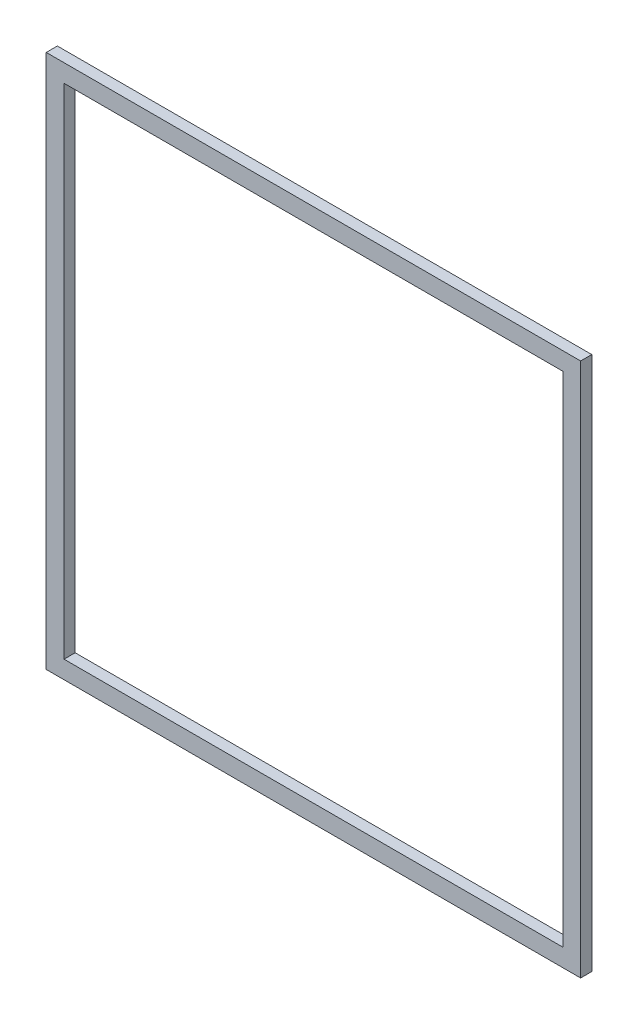
ISO-10303-21;
HEADER;
FILE_DESCRIPTION(('STEP AP214'),'2;1');
FILE_NAME('part.step','',(''),(''),'','','');
FILE_SCHEMA(('AUTOMOTIVE_DESIGN { 1 0 10303 214 1 1 1 1 }'));
ENDSEC;
DATA;
#1=APPLICATION_CONTEXT('core data for automotive mechanical design processes');
#2=APPLICATION_PROTOCOL_DEFINITION('international standard','automotive_design',2000,#1);
#3=PRODUCT_CONTEXT('',#1,'mechanical');
#4=PRODUCT('Part','Part','',(#3));
#5=PRODUCT_RELATED_PRODUCT_CATEGORY('part','',(#4));
#6=PRODUCT_DEFINITION_FORMATION('','',#4);
#7=PRODUCT_DEFINITION_CONTEXT('part definition',#1,'design');
#8=PRODUCT_DEFINITION('design','',#6,#7);
#9=PRODUCT_DEFINITION_SHAPE('','',#8);
#10=(LENGTH_UNIT() NAMED_UNIT(*) SI_UNIT(.MILLI.,.METRE.));
#11=(NAMED_UNIT(*) PLANE_ANGLE_UNIT() SI_UNIT($,.RADIAN.));
#12=(NAMED_UNIT(*) SI_UNIT($,.STERADIAN.) SOLID_ANGLE_UNIT());
#13=UNCERTAINTY_MEASURE_WITH_UNIT(LENGTH_MEASURE(1.E-05),#10,'distance_accuracy_value','');
#14=(GEOMETRIC_REPRESENTATION_CONTEXT(3) GLOBAL_UNCERTAINTY_ASSIGNED_CONTEXT((#13)) GLOBAL_UNIT_ASSIGNED_CONTEXT((#10,
#11,#12)) REPRESENTATION_CONTEXT('',''));
#15=CARTESIAN_POINT('',(0.,0.,0.));
#16=DIRECTION('',(0.,0.,1.));
#17=DIRECTION('',(1.,0.,0.));
#18=AXIS2_PLACEMENT_3D('',#15,#16,#17);
#19=CARTESIAN_POINT('',(-24.,-24.,1.));
#20=DIRECTION('',(0.,0.,1.));
#21=DIRECTION('',(1.,0.,0.));
#22=AXIS2_PLACEMENT_3D('',#19,#20,#21);
#23=PLANE('',#22);
#24=DIRECTION('',(0.,-1.,0.));
#25=VECTOR('',#24,1.);
#26=CARTESIAN_POINT('',(-24.,24.,1.));
#27=LINE('',#26,#25);
#28=CARTESIAN_POINT('',(-24.,24.,1.));
#29=VERTEX_POINT('',#28);
#30=CARTESIAN_POINT('',(-24.,-24.,1.));
#31=VERTEX_POINT('',#30);
#32=EDGE_CURVE('E126',#29,#31,#27,.T.);
#33=ORIENTED_EDGE('',*,*,#32,.T.);
#34=DIRECTION('',(1.,0.,0.));
#35=VECTOR('',#34,1.);
#36=CARTESIAN_POINT('',(-24.,-24.,1.));
#37=LINE('',#36,#35);
#38=CARTESIAN_POINT('',(24.,-24.,1.));
#39=VERTEX_POINT('',#38);
#40=EDGE_CURVE('E129',#31,#39,#37,.T.);
#41=ORIENTED_EDGE('',*,*,#40,.T.);
#42=DIRECTION('',(0.,1.,0.));
#43=VECTOR('',#42,1.);
#44=CARTESIAN_POINT('',(24.,24.,1.));
#45=LINE('',#44,#43);
#46=CARTESIAN_POINT('',(24.,24.,1.));
#47=VERTEX_POINT('',#46);
#48=EDGE_CURVE('E131',#39,#47,#45,.T.);
#49=ORIENTED_EDGE('',*,*,#48,.T.);
#50=DIRECTION('',(-1.,0.,0.));
#51=VECTOR('',#50,1.);
#52=CARTESIAN_POINT('',(-24.,24.,1.));
#53=LINE('',#52,#51);
#54=EDGE_CURVE('E133',#47,#29,#53,.T.);
#55=ORIENTED_EDGE('',*,*,#54,.T.);
#56=EDGE_LOOP('',(#33,#41,#49,#55));
#57=FACE_BOUND('',#56,.T.);
#58=DIRECTION('',(0.,-1.,0.));
#59=VECTOR('',#58,1.);
#60=CARTESIAN_POINT('',(-22.4,22.4,1.));
#61=LINE('',#60,#59);
#62=CARTESIAN_POINT('',(-22.4,22.4,1.));
#63=VERTEX_POINT('',#62);
#64=CARTESIAN_POINT('',(-22.4,-22.4,1.));
#65=VERTEX_POINT('',#64);
#66=EDGE_CURVE('E108',#63,#65,#61,.T.);
#67=ORIENTED_EDGE('',*,*,#66,.F.);
#68=DIRECTION('',(-1.,0.,0.));
#69=VECTOR('',#68,1.);
#70=CARTESIAN_POINT('',(-22.4,22.4,1.));
#71=LINE('',#70,#69);
#72=CARTESIAN_POINT('',(22.4,22.4,1.));
#73=VERTEX_POINT('',#72);
#74=EDGE_CURVE('E97',#73,#63,#71,.T.);
#75=ORIENTED_EDGE('',*,*,#74,.F.);
#76=DIRECTION('',(0.,1.,0.));
#77=VECTOR('',#76,1.);
#78=CARTESIAN_POINT('',(22.4,22.4,1.));
#79=LINE('',#78,#77);
#80=CARTESIAN_POINT('',(22.4,-22.4,1.));
#81=VERTEX_POINT('',#80);
#82=EDGE_CURVE('E112',#81,#73,#79,.T.);
#83=ORIENTED_EDGE('',*,*,#82,.F.);
#84=DIRECTION('',(1.,0.,0.));
#85=VECTOR('',#84,1.);
#86=CARTESIAN_POINT('',(-22.4,-22.4,1.));
#87=LINE('',#86,#85);
#88=EDGE_CURVE('E110',#65,#81,#87,.T.);
#89=ORIENTED_EDGE('',*,*,#88,.F.);
#90=EDGE_LOOP('',(#67,#75,#83,#89));
#91=FACE_BOUND('',#90,.T.);
#92=ADVANCED_FACE('F17',(#57,#91),#23,.T.);
#93=CARTESIAN_POINT('',(-24.,-24.,0.));
#94=DIRECTION('',(0.,0.,1.));
#95=DIRECTION('',(1.,0.,0.));
#96=AXIS2_PLACEMENT_3D('',#93,#94,#95);
#97=PLANE('',#96);
#98=DIRECTION('',(0.,-1.,0.));
#99=VECTOR('',#98,1.);
#100=CARTESIAN_POINT('',(-24.,24.,0.));
#101=LINE('',#100,#99);
#102=CARTESIAN_POINT('',(-24.,24.,0.));
#103=VERTEX_POINT('',#102);
#104=CARTESIAN_POINT('',(-24.,-24.,0.));
#105=VERTEX_POINT('',#104);
#106=EDGE_CURVE('E98',#103,#105,#101,.T.);
#107=ORIENTED_EDGE('',*,*,#106,.F.);
#108=DIRECTION('',(-1.,0.,0.));
#109=VECTOR('',#108,1.);
#110=CARTESIAN_POINT('',(-24.,24.,0.));
#111=LINE('',#110,#109);
#112=CARTESIAN_POINT('',(24.,24.,0.));
#113=VERTEX_POINT('',#112);
#114=EDGE_CURVE('E124',#113,#103,#111,.T.);
#115=ORIENTED_EDGE('',*,*,#114,.F.);
#116=DIRECTION('',(0.,1.,0.));
#117=VECTOR('',#116,1.);
#118=CARTESIAN_POINT('',(24.,24.,0.));
#119=LINE('',#118,#117);
#120=CARTESIAN_POINT('',(24.,-24.,0.));
#121=VERTEX_POINT('',#120);
#122=EDGE_CURVE('E122',#121,#113,#119,.T.);
#123=ORIENTED_EDGE('',*,*,#122,.F.);
#124=DIRECTION('',(1.,0.,0.));
#125=VECTOR('',#124,1.);
#126=CARTESIAN_POINT('',(-24.,-24.,0.));
#127=LINE('',#126,#125);
#128=EDGE_CURVE('E120',#105,#121,#127,.T.);
#129=ORIENTED_EDGE('',*,*,#128,.F.);
#130=EDGE_LOOP('',(#107,#115,#123,#129));
#131=FACE_BOUND('',#130,.T.);
#132=DIRECTION('',(-1.,0.,0.));
#133=VECTOR('',#132,1.);
#134=CARTESIAN_POINT('',(-22.4,22.4,0.));
#135=LINE('',#134,#133);
#136=CARTESIAN_POINT('',(22.4,22.4,0.));
#137=VERTEX_POINT('',#136);
#138=CARTESIAN_POINT('',(-22.4,22.4,0.));
#139=VERTEX_POINT('',#138);
#140=EDGE_CURVE('E40',#137,#139,#135,.T.);
#141=ORIENTED_EDGE('',*,*,#140,.T.);
#142=DIRECTION('',(0.,-1.,0.));
#143=VECTOR('',#142,1.);
#144=CARTESIAN_POINT('',(-22.4,22.4,0.));
#145=LINE('',#144,#143);
#146=CARTESIAN_POINT('',(-22.4,-22.4,0.));
#147=VERTEX_POINT('',#146);
#148=EDGE_CURVE('E84',#139,#147,#145,.T.);
#149=ORIENTED_EDGE('',*,*,#148,.T.);
#150=DIRECTION('',(1.,0.,0.));
#151=VECTOR('',#150,1.);
#152=CARTESIAN_POINT('',(-22.4,-22.4,0.));
#153=LINE('',#152,#151);
#154=CARTESIAN_POINT('',(22.4,-22.4,0.));
#155=VERTEX_POINT('',#154);
#156=EDGE_CURVE('E93',#147,#155,#153,.T.);
#157=ORIENTED_EDGE('',*,*,#156,.T.);
#158=DIRECTION('',(0.,1.,0.));
#159=VECTOR('',#158,1.);
#160=CARTESIAN_POINT('',(22.4,22.4,0.));
#161=LINE('',#160,#159);
#162=EDGE_CURVE('E102',#155,#137,#161,.T.);
#163=ORIENTED_EDGE('',*,*,#162,.T.);
#164=EDGE_LOOP('',(#141,#149,#157,#163));
#165=FACE_BOUND('',#164,.T.);
#166=ADVANCED_FACE('F101',(#131,#165),#97,.F.);
#167=CARTESIAN_POINT('',(-24.,24.,1.));
#168=DIRECTION('',(1.,0.,0.));
#169=DIRECTION('',(0.,0.,-1.));
#170=AXIS2_PLACEMENT_3D('',#167,#168,#169);
#171=PLANE('',#170);
#172=ORIENTED_EDGE('',*,*,#106,.T.);
#173=DIRECTION('',(0.,0.,-1.));
#174=VECTOR('',#173,1.);
#175=CARTESIAN_POINT('',(-24.,-24.,1.));
#176=LINE('',#175,#174);
#177=EDGE_CURVE('E11',#31,#105,#176,.T.);
#178=ORIENTED_EDGE('',*,*,#177,.F.);
#179=ORIENTED_EDGE('',*,*,#32,.F.);
#180=DIRECTION('',(0.,0.,-1.));
#181=VECTOR('',#180,1.);
#182=CARTESIAN_POINT('',(-24.,24.,1.));
#183=LINE('',#182,#181);
#184=EDGE_CURVE('E135',#29,#103,#183,.T.);
#185=ORIENTED_EDGE('',*,*,#184,.T.);
#186=EDGE_LOOP('',(#172,#178,#179,#185));
#187=FACE_BOUND('',#186,.T.);
#188=ADVANCED_FACE('F19',(#187),#171,.F.);
#189=CARTESIAN_POINT('',(-24.,-24.,1.));
#190=DIRECTION('',(0.,1.,0.));
#191=DIRECTION('',(0.,0.,1.));
#192=AXIS2_PLACEMENT_3D('',#189,#190,#191);
#193=PLANE('',#192);
#194=ORIENTED_EDGE('',*,*,#128,.T.);
#195=DIRECTION('',(0.,0.,-1.));
#196=VECTOR('',#195,1.);
#197=CARTESIAN_POINT('',(24.,-24.,1.));
#198=LINE('',#197,#196);
#199=EDGE_CURVE('E25',#39,#121,#198,.T.);
#200=ORIENTED_EDGE('',*,*,#199,.F.);
#201=ORIENTED_EDGE('',*,*,#40,.F.);
#202=ORIENTED_EDGE('',*,*,#177,.T.);
#203=EDGE_LOOP('',(#194,#200,#201,#202));
#204=FACE_BOUND('',#203,.T.);
#205=ADVANCED_FACE('F160',(#204),#193,.F.);
#206=CARTESIAN_POINT('',(24.,24.,1.));
#207=DIRECTION('',(-1.,0.,0.));
#208=DIRECTION('',(0.,0.,1.));
#209=AXIS2_PLACEMENT_3D('',#206,#207,#208);
#210=PLANE('',#209);
#211=ORIENTED_EDGE('',*,*,#122,.T.);
#212=DIRECTION('',(0.,0.,-1.));
#213=VECTOR('',#212,1.);
#214=CARTESIAN_POINT('',(24.,24.,1.));
#215=LINE('',#214,#213);
#216=EDGE_CURVE('E138',#47,#113,#215,.T.);
#217=ORIENTED_EDGE('',*,*,#216,.F.);
#218=ORIENTED_EDGE('',*,*,#48,.F.);
#219=ORIENTED_EDGE('',*,*,#199,.T.);
#220=EDGE_LOOP('',(#211,#217,#218,#219));
#221=FACE_BOUND('',#220,.T.);
#222=ADVANCED_FACE('F145',(#221),#210,.F.);
#223=CARTESIAN_POINT('',(-24.,24.,1.));
#224=DIRECTION('',(0.,-1.,0.));
#225=DIRECTION('',(0.,0.,-1.));
#226=AXIS2_PLACEMENT_3D('',#223,#224,#225);
#227=PLANE('',#226);
#228=ORIENTED_EDGE('',*,*,#114,.T.);
#229=ORIENTED_EDGE('',*,*,#184,.F.);
#230=ORIENTED_EDGE('',*,*,#54,.F.);
#231=ORIENTED_EDGE('',*,*,#216,.T.);
#232=EDGE_LOOP('',(#228,#229,#230,#231));
#233=FACE_BOUND('',#232,.T.);
#234=ADVANCED_FACE('F153',(#233),#227,.F.);
#235=CARTESIAN_POINT('',(-22.4,22.4,1.));
#236=DIRECTION('',(0.,-1.,0.));
#237=DIRECTION('',(0.,0.,-1.));
#238=AXIS2_PLACEMENT_3D('',#235,#236,#237);
#239=PLANE('',#238);
#240=ORIENTED_EDGE('',*,*,#140,.F.);
#241=DIRECTION('',(0.,0.,-1.));
#242=VECTOR('',#241,1.);
#243=CARTESIAN_POINT('',(22.4,22.4,1.));
#244=LINE('',#243,#242);
#245=EDGE_CURVE('E114',#73,#137,#244,.T.);
#246=ORIENTED_EDGE('',*,*,#245,.F.);
#247=ORIENTED_EDGE('',*,*,#74,.T.);
#248=DIRECTION('',(0.,0.,-1.));
#249=VECTOR('',#248,1.);
#250=CARTESIAN_POINT('',(-22.4,22.4,1.));
#251=LINE('',#250,#249);
#252=EDGE_CURVE('E86',#63,#139,#251,.T.);
#253=ORIENTED_EDGE('',*,*,#252,.T.);
#254=EDGE_LOOP('',(#240,#246,#247,#253));
#255=FACE_BOUND('',#254,.T.);
#256=ADVANCED_FACE('F95',(#255),#239,.T.);
#257=CARTESIAN_POINT('',(-22.4,22.4,1.));
#258=DIRECTION('',(1.,0.,0.));
#259=DIRECTION('',(0.,1.,0.));
#260=AXIS2_PLACEMENT_3D('',#257,#258,#259);
#261=PLANE('',#260);
#262=ORIENTED_EDGE('',*,*,#148,.F.);
#263=ORIENTED_EDGE('',*,*,#252,.F.);
#264=ORIENTED_EDGE('',*,*,#66,.T.);
#265=DIRECTION('',(0.,0.,-1.));
#266=VECTOR('',#265,1.);
#267=CARTESIAN_POINT('',(-22.4,-22.4,1.));
#268=LINE('',#267,#266);
#269=EDGE_CURVE('E89',#65,#147,#268,.T.);
#270=ORIENTED_EDGE('',*,*,#269,.T.);
#271=EDGE_LOOP('',(#262,#263,#264,#270));
#272=FACE_BOUND('',#271,.T.);
#273=ADVANCED_FACE('F85',(#272),#261,.T.);
#274=CARTESIAN_POINT('',(-22.4,-22.4,1.));
#275=DIRECTION('',(0.,1.,0.));
#276=DIRECTION('',(-1.,0.,0.));
#277=AXIS2_PLACEMENT_3D('',#274,#275,#276);
#278=PLANE('',#277);
#279=ORIENTED_EDGE('',*,*,#156,.F.);
#280=ORIENTED_EDGE('',*,*,#269,.F.);
#281=ORIENTED_EDGE('',*,*,#88,.T.);
#282=DIRECTION('',(0.,0.,-1.));
#283=VECTOR('',#282,1.);
#284=CARTESIAN_POINT('',(22.4,-22.4,1.));
#285=LINE('',#284,#283);
#286=EDGE_CURVE('E32',#81,#155,#285,.T.);
#287=ORIENTED_EDGE('',*,*,#286,.T.);
#288=EDGE_LOOP('',(#279,#280,#281,#287));
#289=FACE_BOUND('',#288,.T.);
#290=ADVANCED_FACE('F183',(#289),#278,.T.);
#291=CARTESIAN_POINT('',(22.4,22.4,1.));
#292=DIRECTION('',(-1.,0.,0.));
#293=DIRECTION('',(0.,-1.,0.));
#294=AXIS2_PLACEMENT_3D('',#291,#292,#293);
#295=PLANE('',#294);
#296=ORIENTED_EDGE('',*,*,#162,.F.);
#297=ORIENTED_EDGE('',*,*,#286,.F.);
#298=ORIENTED_EDGE('',*,*,#82,.T.);
#299=ORIENTED_EDGE('',*,*,#245,.T.);
#300=EDGE_LOOP('',(#296,#297,#298,#299));
#301=FACE_BOUND('',#300,.T.);
#302=ADVANCED_FACE('F188',(#301),#295,.T.);
#303=CLOSED_SHELL('',(#92,#166,#188,#205,#222,#234,#256,#273,#290,#302));
#304=MANIFOLD_SOLID_BREP('B1',#303);
#305=ADVANCED_BREP_SHAPE_REPRESENTATION('',(#18,#304),#14);
#306=SHAPE_DEFINITION_REPRESENTATION(#9,#305);
ENDSEC;
END-ISO-10303-21;
